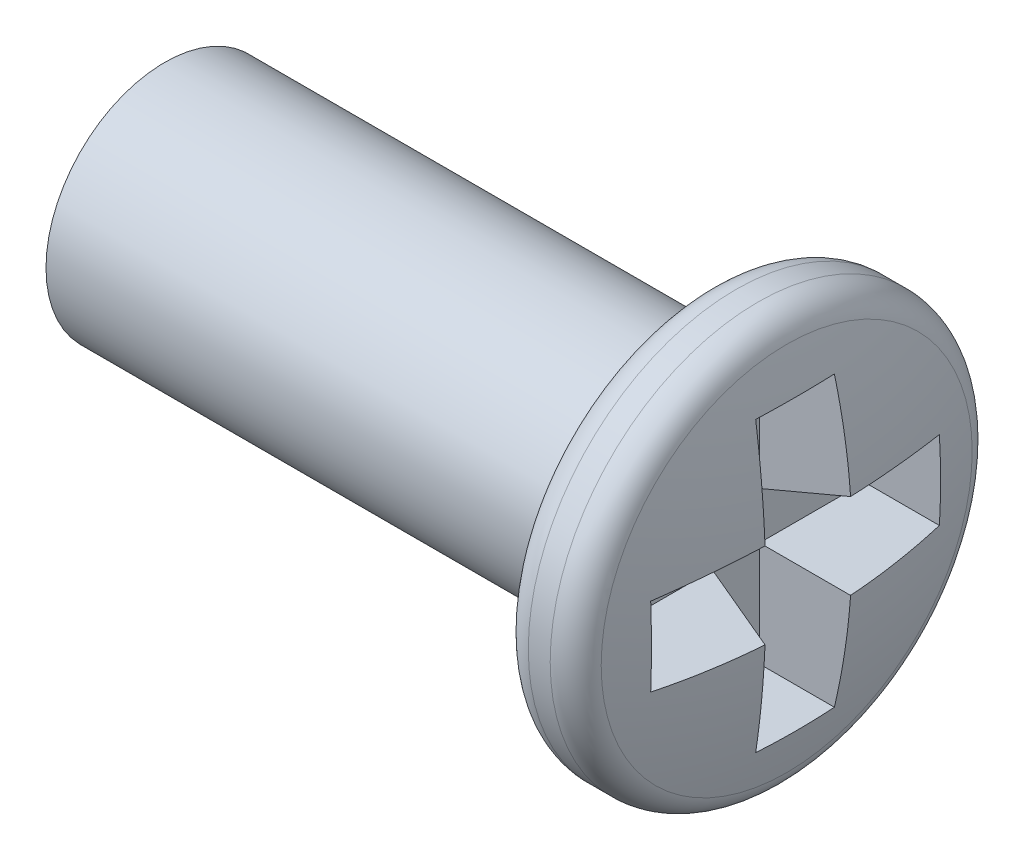
ISO-10303-21;
HEADER;
FILE_DESCRIPTION(('STEP AP214'),'2;1');
FILE_NAME('part.step','',(''),(''),'','','');
FILE_SCHEMA(('AUTOMOTIVE_DESIGN { 1 0 10303 214 1 1 1 1 }'));
ENDSEC;
DATA;
#1=APPLICATION_CONTEXT('core data for automotive mechanical design processes');
#2=APPLICATION_PROTOCOL_DEFINITION('international standard','automotive_design',2000,#1);
#3=PRODUCT_CONTEXT('',#1,'mechanical');
#4=PRODUCT('Part','Part','',(#3));
#5=PRODUCT_RELATED_PRODUCT_CATEGORY('part','',(#4));
#6=PRODUCT_DEFINITION_FORMATION('','',#4);
#7=PRODUCT_DEFINITION_CONTEXT('part definition',#1,'design');
#8=PRODUCT_DEFINITION('design','',#6,#7);
#9=PRODUCT_DEFINITION_SHAPE('','',#8);
#10=(LENGTH_UNIT() NAMED_UNIT(*) SI_UNIT(.MILLI.,.METRE.));
#11=(NAMED_UNIT(*) PLANE_ANGLE_UNIT() SI_UNIT($,.RADIAN.));
#12=(NAMED_UNIT(*) SI_UNIT($,.STERADIAN.) SOLID_ANGLE_UNIT());
#13=UNCERTAINTY_MEASURE_WITH_UNIT(LENGTH_MEASURE(1.E-05),#10,'distance_accuracy_value','');
#14=(GEOMETRIC_REPRESENTATION_CONTEXT(3) GLOBAL_UNCERTAINTY_ASSIGNED_CONTEXT((#13)) GLOBAL_UNIT_ASSIGNED_CONTEXT((#10,
#11,#12)) REPRESENTATION_CONTEXT('',''));
#15=CARTESIAN_POINT('',(0.,0.,0.));
#16=DIRECTION('',(0.,0.,1.));
#17=DIRECTION('',(1.,0.,0.));
#18=AXIS2_PLACEMENT_3D('',#15,#16,#17);
#19=CARTESIAN_POINT('',(0.,0.8,0.));
#20=DIRECTION('',(1.,0.,0.));
#21=DIRECTION('',(0.,0.,-1.));
#22=AXIS2_PLACEMENT_3D('',#19,#20,#21);
#23=PLANE('',#22);
#24=CARTESIAN_POINT('',(0.,0.,0.));
#25=DIRECTION('',(-1.,0.,0.));
#26=DIRECTION('',(0.,0.,1.));
#27=AXIS2_PLACEMENT_3D('',#24,#25,#26);
#28=CIRCLE('',#27,0.8);
#29=CARTESIAN_POINT('',(0.,0.,0.8));
#30=VERTEX_POINT('',#29);
#31=EDGE_CURVE('E158',#30,#30,#28,.T.);
#32=ORIENTED_EDGE('',*,*,#31,.T.);
#33=EDGE_LOOP('',(#32));
#34=FACE_BOUND('',#33,.T.);
#35=ADVANCED_FACE('F41',(#34),#23,.F.);
#36=CARTESIAN_POINT('',(-0.649999999999987,0.,0.));
#37=DIRECTION('',(-1.,0.,0.));
#38=DIRECTION('',(0.,1.,0.));
#39=AXIS2_PLACEMENT_3D('',#36,#37,#38);
#40=SPHERICAL_SURFACE('',#39,4.99999999999999);
#41=CARTESIAN_POINT('',(-0.388246241920137,0.,-0.976878324226091));
#42=DIRECTION('',(-0.258819045102521,0.,0.965925826289068));
#43=DIRECTION('',(0.965925826289068,0.,0.258819045102521));
#44=AXIS2_PLACEMENT_3D('',#41,#42,#43);
#45=CIRCLE('',#44,4.89665127508465);
#46=CARTESIAN_POINT('',(4.33335234348308,0.288270203716636,0.288270203716636));
#47=VERTEX_POINT('',#46);
#48=CARTESIAN_POINT('',(4.24733772425329,0.972491726120527,0.265222655956741));
#49=VERTEX_POINT('',#48);
#50=EDGE_CURVE('E240',#47,#49,#45,.T.);
#51=ORIENTED_EDGE('',*,*,#50,.T.);
#52=CARTESIAN_POINT('',(-0.565063509461084,-0.31698729810778,0.));
#53=DIRECTION('',(-0.258819045102521,0.965925826289068,0.));
#54=DIRECTION('',(-0.965925826289068,-0.258819045102521,0.));
#55=AXIS2_PLACEMENT_3D('',#52,#53,#54);
#56=CIRCLE('',#55,4.98921886124603);
#57=CARTESIAN_POINT('',(4.24733772425329,0.972491726120527,-0.265222655956741));
#58=VERTEX_POINT('',#57);
#59=EDGE_CURVE('E11',#49,#58,#56,.T.);
#60=ORIENTED_EDGE('',*,*,#59,.T.);
#61=CARTESIAN_POINT('',(-0.388246241920137,0.,0.976878324226092));
#62=DIRECTION('',(-0.258819045102521,0.,-0.965925826289068));
#63=DIRECTION('',(-0.965925826289068,0.,0.258819045102521));
#64=AXIS2_PLACEMENT_3D('',#61,#62,#63);
#65=CIRCLE('',#64,4.89665127508465);
#66=CARTESIAN_POINT('',(4.33335234348308,0.288270203716636,-0.288270203716636));
#67=VERTEX_POINT('',#66);
#68=EDGE_CURVE('E50',#58,#67,#65,.T.);
#69=ORIENTED_EDGE('',*,*,#68,.T.);
#70=CARTESIAN_POINT('',(-0.388246241920137,-0.976878324226091,0.));
#71=DIRECTION('',(-0.258819045102521,0.965925826289068,0.));
#72=DIRECTION('',(-0.965925826289068,-0.258819045102521,0.));
#73=AXIS2_PLACEMENT_3D('',#70,#71,#72);
#74=CIRCLE('',#73,4.89665127508465);
#75=CARTESIAN_POINT('',(4.24733772425329,0.265222655956742,-0.972491726120527));
#76=VERTEX_POINT('',#75);
#77=EDGE_CURVE('E276',#67,#76,#74,.T.);
#78=ORIENTED_EDGE('',*,*,#77,.T.);
#79=CARTESIAN_POINT('',(-0.565063509461084,0.,0.31698729810778));
#80=DIRECTION('',(-0.258819045102521,0.,-0.965925826289068));
#81=DIRECTION('',(-0.965925826289068,0.,0.258819045102521));
#82=AXIS2_PLACEMENT_3D('',#79,#80,#81);
#83=CIRCLE('',#82,4.98921886124603);
#84=CARTESIAN_POINT('',(4.24733772425329,-0.265222655956742,-0.972491726120527));
#85=VERTEX_POINT('',#84);
#86=EDGE_CURVE('E272',#76,#85,#83,.T.);
#87=ORIENTED_EDGE('',*,*,#86,.T.);
#88=CARTESIAN_POINT('',(-0.388246241920137,0.976878324226091,0.));
#89=DIRECTION('',(-0.258819045102521,-0.965925826289068,0.));
#90=DIRECTION('',(0.965925826289068,-0.258819045102521,0.));
#91=AXIS2_PLACEMENT_3D('',#88,#89,#90);
#92=CIRCLE('',#91,4.89665127508465);
#93=CARTESIAN_POINT('',(4.33335234348308,-0.288270203716636,-0.288270203716636));
#94=VERTEX_POINT('',#93);
#95=EDGE_CURVE('E268',#85,#94,#92,.T.);
#96=ORIENTED_EDGE('',*,*,#95,.T.);
#97=CARTESIAN_POINT('',(-0.388246241920137,0.,0.976878324226091));
#98=DIRECTION('',(-0.258819045102521,0.,-0.965925826289068));
#99=DIRECTION('',(-0.965925826289068,0.,0.258819045102521));
#100=AXIS2_PLACEMENT_3D('',#97,#98,#99);
#101=CIRCLE('',#100,4.89665127508465);
#102=CARTESIAN_POINT('',(4.24733772425329,-0.972491726120527,-0.265222655956742));
#103=VERTEX_POINT('',#102);
#104=EDGE_CURVE('E264',#94,#103,#101,.T.);
#105=ORIENTED_EDGE('',*,*,#104,.T.);
#106=CARTESIAN_POINT('',(-0.565063509461084,0.31698729810778,0.));
#107=DIRECTION('',(-0.258819045102521,-0.965925826289068,0.));
#108=DIRECTION('',(0.965925826289068,-0.258819045102521,0.));
#109=AXIS2_PLACEMENT_3D('',#106,#107,#108);
#110=CIRCLE('',#109,4.98921886124603);
#111=CARTESIAN_POINT('',(4.24733772425329,-0.972491726120527,0.265222655956742));
#112=VERTEX_POINT('',#111);
#113=EDGE_CURVE('E260',#103,#112,#110,.T.);
#114=ORIENTED_EDGE('',*,*,#113,.T.);
#115=CARTESIAN_POINT('',(-0.388246241920137,0.,-0.976878324226091));
#116=DIRECTION('',(-0.258819045102521,0.,0.965925826289068));
#117=DIRECTION('',(0.965925826289068,0.,0.258819045102521));
#118=AXIS2_PLACEMENT_3D('',#115,#116,#117);
#119=CIRCLE('',#118,4.89665127508465);
#120=CARTESIAN_POINT('',(4.33335234348308,-0.288270203716636,0.288270203716636));
#121=VERTEX_POINT('',#120);
#122=EDGE_CURVE('E256',#112,#121,#119,.T.);
#123=ORIENTED_EDGE('',*,*,#122,.T.);
#124=CARTESIAN_POINT('',(-0.388246241920137,0.976878324226091,0.));
#125=DIRECTION('',(-0.258819045102521,-0.965925826289068,0.));
#126=DIRECTION('',(0.965925826289068,-0.258819045102521,0.));
#127=AXIS2_PLACEMENT_3D('',#124,#125,#126);
#128=CIRCLE('',#127,4.89665127508465);
#129=CARTESIAN_POINT('',(4.24733772425329,-0.265222655956742,0.972491726120527));
#130=VERTEX_POINT('',#129);
#131=EDGE_CURVE('E252',#121,#130,#128,.T.);
#132=ORIENTED_EDGE('',*,*,#131,.T.);
#133=CARTESIAN_POINT('',(-0.565063509461084,0.,-0.31698729810778));
#134=DIRECTION('',(-0.258819045102521,0.,0.965925826289068));
#135=DIRECTION('',(0.965925826289068,0.,0.258819045102521));
#136=AXIS2_PLACEMENT_3D('',#133,#134,#135);
#137=CIRCLE('',#136,4.98921886124603);
#138=CARTESIAN_POINT('',(4.24733772425329,0.265222655956742,0.972491726120527));
#139=VERTEX_POINT('',#138);
#140=EDGE_CURVE('E248',#130,#139,#137,.T.);
#141=ORIENTED_EDGE('',*,*,#140,.T.);
#142=CARTESIAN_POINT('',(-0.388246241920137,-0.976878324226091,0.));
#143=DIRECTION('',(-0.258819045102521,0.965925826289068,0.));
#144=DIRECTION('',(-0.965925826289068,-0.258819045102521,0.));
#145=AXIS2_PLACEMENT_3D('',#142,#143,#144);
#146=CIRCLE('',#145,4.89665127508465);
#147=EDGE_CURVE('E244',#139,#47,#146,.T.);
#148=ORIENTED_EDGE('',*,*,#147,.T.);
#149=EDGE_LOOP('',(#51,#60,#69,#78,#87,#96,#105,#114,#123,#132,#141,#148));
#150=FACE_BOUND('',#149,.T.);
#151=CARTESIAN_POINT('',(4.19122918275927,0.,0.));
#152=DIRECTION('',(-1.,0.,0.));
#153=DIRECTION('',(0.,0.,1.));
#154=AXIS2_PLACEMENT_3D('',#151,#152,#153);
#155=CIRCLE('',#154,1.25);
#156=CARTESIAN_POINT('',(4.19122918275927,0.,1.25));
#157=VERTEX_POINT('',#156);
#158=EDGE_CURVE('E236',#157,#157,#155,.F.);
#159=ORIENTED_EDGE('',*,*,#158,.T.);
#160=EDGE_LOOP('',(#159));
#161=FACE_BOUND('',#160,.T.);
#162=ADVANCED_FACE('F281',(#150,#161),#40,.T.);
#163=CARTESIAN_POINT('',(-102.038169229657,0.,0.));
#164=DIRECTION('',(-1.,0.,0.));
#165=DIRECTION('',(0.,0.,1.));
#166=AXIS2_PLACEMENT_3D('',#163,#164,#165);
#167=CYLINDRICAL_SURFACE('',#166,1.4);
#168=CARTESIAN_POINT('',(3.85000000000001,0.,0.));
#169=DIRECTION('',(1.,0.,0.));
#170=DIRECTION('',(0.,0.,-1.));
#171=AXIS2_PLACEMENT_3D('',#168,#169,#170);
#172=CIRCLE('',#171,1.4);
#173=CARTESIAN_POINT('',(3.85000000000001,0.,-1.4));
#174=VERTEX_POINT('',#173);
#175=EDGE_CURVE('E232',#174,#174,#172,.T.);
#176=ORIENTED_EDGE('',*,*,#175,.T.);
#177=EDGE_LOOP('',(#176));
#178=FACE_BOUND('',#177,.T.);
#179=CARTESIAN_POINT('',(3.99758001544891,0.,0.));
#180=DIRECTION('',(-1.,0.,0.));
#181=DIRECTION('',(0.,0.,1.));
#182=AXIS2_PLACEMENT_3D('',#179,#180,#181);
#183=CIRCLE('',#182,1.4);
#184=CARTESIAN_POINT('',(3.99758001544891,0.,1.4));
#185=VERTEX_POINT('',#184);
#186=EDGE_CURVE('E228',#185,#185,#183,.T.);
#187=ORIENTED_EDGE('',*,*,#186,.T.);
#188=EDGE_LOOP('',(#187));
#189=FACE_BOUND('',#188,.T.);
#190=ADVANCED_FACE('F359',(#178,#189),#167,.T.);
#191=CARTESIAN_POINT('',(3.65,1.4,0.));
#192=DIRECTION('',(1.,0.,0.));
#193=DIRECTION('',(0.,0.,-1.));
#194=AXIS2_PLACEMENT_3D('',#191,#192,#193);
#195=PLANE('',#194);
#196=CARTESIAN_POINT('',(3.65,0.,0.));
#197=DIRECTION('',(1.,0.,0.));
#198=DIRECTION('',(0.,0.,-1.));
#199=AXIS2_PLACEMENT_3D('',#196,#197,#198);
#200=CIRCLE('',#199,1.2);
#201=CARTESIAN_POINT('',(3.65,0.,-1.2));
#202=VERTEX_POINT('',#201);
#203=EDGE_CURVE('E224',#202,#202,#200,.F.);
#204=ORIENTED_EDGE('',*,*,#203,.T.);
#205=EDGE_LOOP('',(#204));
#206=FACE_BOUND('',#205,.T.);
#207=CARTESIAN_POINT('',(3.65,0.,0.));
#208=DIRECTION('',(-1.,0.,0.));
#209=DIRECTION('',(0.,0.,1.));
#210=AXIS2_PLACEMENT_3D('',#207,#208,#209);
#211=CIRCLE('',#210,0.8);
#212=CARTESIAN_POINT('',(3.65,0.,0.8));
#213=VERTEX_POINT('',#212);
#214=EDGE_CURVE('E220',#213,#213,#211,.T.);
#215=ORIENTED_EDGE('',*,*,#214,.F.);
#216=EDGE_LOOP('',(#215));
#217=FACE_BOUND('',#216,.T.);
#218=ADVANCED_FACE('F371',(#206,#217),#195,.F.);
#219=CARTESIAN_POINT('',(-102.038169229657,0.,0.));
#220=DIRECTION('',(-1.,0.,0.));
#221=DIRECTION('',(0.,0.,1.));
#222=AXIS2_PLACEMENT_3D('',#219,#220,#221);
#223=CYLINDRICAL_SURFACE('',#222,0.8);
#224=ORIENTED_EDGE('',*,*,#31,.F.);
#225=EDGE_LOOP('',(#224));
#226=FACE_BOUND('',#225,.T.);
#227=ORIENTED_EDGE('',*,*,#214,.T.);
#228=EDGE_LOOP('',(#227));
#229=FACE_BOUND('',#228,.T.);
#230=ADVANCED_FACE('F364',(#226,#229),#223,.T.);
#231=CARTESIAN_POINT('',(3.85000000000001,0.,0.));
#232=DIRECTION('',(1.,0.,0.));
#233=DIRECTION('',(0.,0.,-1.));
#234=AXIS2_PLACEMENT_3D('',#231,#232,#233);
#235=TOROIDAL_SURFACE('',#234,1.2,0.2);
#236=ORIENTED_EDGE('',*,*,#175,.F.);
#237=EDGE_LOOP('',(#236));
#238=FACE_BOUND('',#237,.T.);
#239=ORIENTED_EDGE('',*,*,#203,.F.);
#240=EDGE_LOOP('',(#239));
#241=FACE_BOUND('',#240,.T.);
#242=ADVANCED_FACE('F362',(#238,#241),#235,.T.);
#243=CARTESIAN_POINT('',(3.9975800154489,0.,0.));
#244=DIRECTION('',(-1.,0.,0.));
#245=DIRECTION('',(0.,0.,1.));
#246=AXIS2_PLACEMENT_3D('',#243,#244,#245);
#247=TOROIDAL_SURFACE('',#246,1.2,0.2);
#248=ORIENTED_EDGE('',*,*,#158,.F.);
#249=EDGE_LOOP('',(#248));
#250=FACE_BOUND('',#249,.T.);
#251=ORIENTED_EDGE('',*,*,#186,.F.);
#252=EDGE_LOOP('',(#251));
#253=FACE_BOUND('',#252,.T.);
#254=ADVANCED_FACE('F43',(#250,#253),#247,.T.);
#255=CARTESIAN_POINT('',(4.35,1.,0.292730929836214));
#256=DIRECTION('',(-0.258819045102521,0.965925826289068,0.));
#257=DIRECTION('',(-0.965925826289068,-0.258819045102521,0.));
#258=AXIS2_PLACEMENT_3D('',#255,#256,#257);
#259=PLANE('',#258);
#260=DIRECTION('',(0.935113126531029,0.250562807085732,0.250562807085732));
#261=VECTOR('',#260,1.);
#262=CARTESIAN_POINT('',(4.35,1.,0.292730929836214));
#263=LINE('',#262,#261);
#264=CARTESIAN_POINT('',(3.85,0.866025403784438,0.158756333620653));
#265=VERTEX_POINT('',#264);
#266=EDGE_CURVE('E60',#265,#49,#263,.T.);
#267=ORIENTED_EDGE('',*,*,#266,.F.);
#268=DIRECTION('',(0.,0.,1.));
#269=VECTOR('',#268,1.);
#270=CARTESIAN_POINT('',(3.85,0.866025403784438,0.292730929836214));
#271=LINE('',#270,#269);
#272=CARTESIAN_POINT('',(3.85,0.866025403784438,-0.158756333620653));
#273=VERTEX_POINT('',#272);
#274=EDGE_CURVE('E162',#273,#265,#271,.T.);
#275=ORIENTED_EDGE('',*,*,#274,.F.);
#276=DIRECTION('',(0.935113126531029,0.250562807085732,-0.250562807085732));
#277=VECTOR('',#276,1.);
#278=CARTESIAN_POINT('',(4.35,1.,-0.292730929836215));
#279=LINE('',#278,#277);
#280=EDGE_CURVE('E151',#273,#58,#279,.T.);
#281=ORIENTED_EDGE('',*,*,#280,.T.);
#282=ORIENTED_EDGE('',*,*,#59,.F.);
#283=EDGE_LOOP('',(#267,#275,#281,#282));
#284=FACE_BOUND('',#283,.T.);
#285=ADVANCED_FACE('F163',(#284),#259,.F.);
#286=CARTESIAN_POINT('',(4.35,1.,-0.292730929836215));
#287=DIRECTION('',(-0.258819045102521,0.,-0.965925826289068));
#288=DIRECTION('',(-0.965925826289068,0.,0.258819045102521));
#289=AXIS2_PLACEMENT_3D('',#286,#287,#288);
#290=PLANE('',#289);
#291=ORIENTED_EDGE('',*,*,#280,.F.);
#292=DIRECTION('',(0.,1.,0.));
#293=VECTOR('',#292,1.);
#294=CARTESIAN_POINT('',(3.85,1.,-0.158756333620653));
#295=LINE('',#294,#293);
#296=CARTESIAN_POINT('',(3.85,0.158756333620653,-0.158756333620653));
#297=VERTEX_POINT('',#296);
#298=EDGE_CURVE('E155',#297,#273,#295,.T.);
#299=ORIENTED_EDGE('',*,*,#298,.F.);
#300=DIRECTION('',(0.935113126531029,0.250562807085732,-0.250562807085732));
#301=VECTOR('',#300,1.);
#302=CARTESIAN_POINT('',(4.51571637530692,0.337134498772317,-0.337134498772317));
#303=LINE('',#302,#301);
#304=EDGE_CURVE('E159',#297,#67,#303,.T.);
#305=ORIENTED_EDGE('',*,*,#304,.T.);
#306=ORIENTED_EDGE('',*,*,#68,.F.);
#307=EDGE_LOOP('',(#291,#299,#305,#306));
#308=FACE_BOUND('',#307,.T.);
#309=ADVANCED_FACE('F153',(#308),#290,.F.);
#310=CARTESIAN_POINT('',(4.35,0.292730929836215,-0.292730929836214));
#311=DIRECTION('',(-0.258819045102521,0.965925826289068,0.));
#312=DIRECTION('',(-0.965925826289068,-0.258819045102521,0.));
#313=AXIS2_PLACEMENT_3D('',#310,#311,#312);
#314=PLANE('',#313);
#315=ORIENTED_EDGE('',*,*,#304,.F.);
#316=DIRECTION('',(0.,0.,1.));
#317=VECTOR('',#316,1.);
#318=CARTESIAN_POINT('',(3.85,0.158756333620653,-0.292730929836214));
#319=LINE('',#318,#317);
#320=CARTESIAN_POINT('',(3.85,0.158756333620653,-0.866025403784438));
#321=VERTEX_POINT('',#320);
#322=EDGE_CURVE('E173',#321,#297,#319,.T.);
#323=ORIENTED_EDGE('',*,*,#322,.F.);
#324=DIRECTION('',(0.935113126531029,0.250562807085732,-0.250562807085732));
#325=VECTOR('',#324,1.);
#326=CARTESIAN_POINT('',(4.35,0.292730929836215,-1.));
#327=LINE('',#326,#325);
#328=EDGE_CURVE('E319',#321,#76,#327,.T.);
#329=ORIENTED_EDGE('',*,*,#328,.T.);
#330=ORIENTED_EDGE('',*,*,#77,.F.);
#331=EDGE_LOOP('',(#315,#323,#329,#330));
#332=FACE_BOUND('',#331,.T.);
#333=ADVANCED_FACE('F323',(#332),#314,.F.);
#334=CARTESIAN_POINT('',(4.35,0.292730929836215,-1.));
#335=DIRECTION('',(-0.258819045102521,0.,-0.965925826289068));
#336=DIRECTION('',(-0.965925826289068,0.,0.258819045102521));
#337=AXIS2_PLACEMENT_3D('',#334,#335,#336);
#338=PLANE('',#337);
#339=ORIENTED_EDGE('',*,*,#328,.F.);
#340=DIRECTION('',(0.,1.,0.));
#341=VECTOR('',#340,1.);
#342=CARTESIAN_POINT('',(3.85,0.292730929836215,-0.866025403784438));
#343=LINE('',#342,#341);
#344=CARTESIAN_POINT('',(3.85,-0.158756333620653,-0.866025403784438));
#345=VERTEX_POINT('',#344);
#346=EDGE_CURVE('E181',#345,#321,#343,.T.);
#347=ORIENTED_EDGE('',*,*,#346,.F.);
#348=DIRECTION('',(0.935113126531029,-0.250562807085732,-0.250562807085732));
#349=VECTOR('',#348,1.);
#350=CARTESIAN_POINT('',(4.35,-0.292730929836214,-1.));
#351=LINE('',#350,#349);
#352=EDGE_CURVE('E315',#345,#85,#351,.T.);
#353=ORIENTED_EDGE('',*,*,#352,.T.);
#354=ORIENTED_EDGE('',*,*,#86,.F.);
#355=EDGE_LOOP('',(#339,#347,#353,#354));
#356=FACE_BOUND('',#355,.T.);
#357=ADVANCED_FACE('F326',(#356),#338,.F.);
#358=CARTESIAN_POINT('',(4.35,-0.292730929836214,-1.));
#359=DIRECTION('',(-0.258819045102521,-0.965925826289068,0.));
#360=DIRECTION('',(0.965925826289068,-0.258819045102521,0.));
#361=AXIS2_PLACEMENT_3D('',#358,#359,#360);
#362=PLANE('',#361);
#363=ORIENTED_EDGE('',*,*,#352,.F.);
#364=DIRECTION('',(0.,0.,-1.));
#365=VECTOR('',#364,1.);
#366=CARTESIAN_POINT('',(3.85,-0.158756333620653,-1.));
#367=LINE('',#366,#365);
#368=CARTESIAN_POINT('',(3.85,-0.158756333620653,-0.158756333620653));
#369=VERTEX_POINT('',#368);
#370=EDGE_CURVE('E187',#369,#345,#367,.T.);
#371=ORIENTED_EDGE('',*,*,#370,.F.);
#372=DIRECTION('',(0.935113126531029,-0.250562807085732,-0.250562807085732));
#373=VECTOR('',#372,1.);
#374=CARTESIAN_POINT('',(4.51571637530692,-0.337134498772317,-0.337134498772317));
#375=LINE('',#374,#373);
#376=EDGE_CURVE('E311',#369,#94,#375,.T.);
#377=ORIENTED_EDGE('',*,*,#376,.T.);
#378=ORIENTED_EDGE('',*,*,#95,.F.);
#379=EDGE_LOOP('',(#363,#371,#377,#378));
#380=FACE_BOUND('',#379,.T.);
#381=ADVANCED_FACE('F328',(#380),#362,.F.);
#382=CARTESIAN_POINT('',(4.35,-0.292730929836215,-0.292730929836214));
#383=DIRECTION('',(-0.258819045102521,0.,-0.965925826289068));
#384=DIRECTION('',(-0.965925826289068,0.,0.258819045102521));
#385=AXIS2_PLACEMENT_3D('',#382,#383,#384);
#386=PLANE('',#385);
#387=ORIENTED_EDGE('',*,*,#376,.F.);
#388=DIRECTION('',(0.,1.,0.));
#389=VECTOR('',#388,1.);
#390=CARTESIAN_POINT('',(3.85,-0.292730929836215,-0.158756333620653));
#391=LINE('',#390,#389);
#392=CARTESIAN_POINT('',(3.85,-0.866025403784438,-0.158756333620653));
#393=VERTEX_POINT('',#392);
#394=EDGE_CURVE('E191',#393,#369,#391,.T.);
#395=ORIENTED_EDGE('',*,*,#394,.F.);
#396=DIRECTION('',(0.935113126531029,-0.250562807085732,-0.250562807085732));
#397=VECTOR('',#396,1.);
#398=CARTESIAN_POINT('',(4.35,-1.,-0.292730929836215));
#399=LINE('',#398,#397);
#400=EDGE_CURVE('E307',#393,#103,#399,.T.);
#401=ORIENTED_EDGE('',*,*,#400,.T.);
#402=ORIENTED_EDGE('',*,*,#104,.F.);
#403=EDGE_LOOP('',(#387,#395,#401,#402));
#404=FACE_BOUND('',#403,.T.);
#405=ADVANCED_FACE('F332',(#404),#386,.F.);
#406=CARTESIAN_POINT('',(4.35,-1.,-0.292730929836215));
#407=DIRECTION('',(-0.258819045102521,-0.965925826289068,0.));
#408=DIRECTION('',(0.965925826289068,-0.258819045102521,0.));
#409=AXIS2_PLACEMENT_3D('',#406,#407,#408);
#410=PLANE('',#409);
#411=ORIENTED_EDGE('',*,*,#400,.F.);
#412=DIRECTION('',(0.,0.,-1.));
#413=VECTOR('',#412,1.);
#414=CARTESIAN_POINT('',(3.85,-0.866025403784438,-0.292730929836215));
#415=LINE('',#414,#413);
#416=CARTESIAN_POINT('',(3.85,-0.866025403784438,0.158756333620653));
#417=VERTEX_POINT('',#416);
#418=EDGE_CURVE('E195',#417,#393,#415,.T.);
#419=ORIENTED_EDGE('',*,*,#418,.F.);
#420=DIRECTION('',(0.935113126531029,-0.250562807085732,0.250562807085732));
#421=VECTOR('',#420,1.);
#422=CARTESIAN_POINT('',(4.35,-1.,0.292730929836214));
#423=LINE('',#422,#421);
#424=EDGE_CURVE('E303',#417,#112,#423,.T.);
#425=ORIENTED_EDGE('',*,*,#424,.T.);
#426=ORIENTED_EDGE('',*,*,#113,.F.);
#427=EDGE_LOOP('',(#411,#419,#425,#426));
#428=FACE_BOUND('',#427,.T.);
#429=ADVANCED_FACE('F335',(#428),#410,.F.);
#430=CARTESIAN_POINT('',(4.35,-1.,0.292730929836214));
#431=DIRECTION('',(-0.258819045102521,0.,0.965925826289068));
#432=DIRECTION('',(0.965925826289068,0.,0.258819045102521));
#433=AXIS2_PLACEMENT_3D('',#430,#431,#432);
#434=PLANE('',#433);
#435=ORIENTED_EDGE('',*,*,#424,.F.);
#436=DIRECTION('',(0.,-1.,0.));
#437=VECTOR('',#436,1.);
#438=CARTESIAN_POINT('',(3.85,-1.,0.158756333620653));
#439=LINE('',#438,#437);
#440=CARTESIAN_POINT('',(3.85,-0.158756333620653,0.158756333620653));
#441=VERTEX_POINT('',#440);
#442=EDGE_CURVE('E199',#441,#417,#439,.T.);
#443=ORIENTED_EDGE('',*,*,#442,.F.);
#444=DIRECTION('',(0.935113126531029,-0.250562807085732,0.250562807085732));
#445=VECTOR('',#444,1.);
#446=CARTESIAN_POINT('',(4.51571637530692,-0.337134498772317,0.337134498772317));
#447=LINE('',#446,#445);
#448=EDGE_CURVE('E299',#441,#121,#447,.T.);
#449=ORIENTED_EDGE('',*,*,#448,.T.);
#450=ORIENTED_EDGE('',*,*,#122,.F.);
#451=EDGE_LOOP('',(#435,#443,#449,#450));
#452=FACE_BOUND('',#451,.T.);
#453=ADVANCED_FACE('F337',(#452),#434,.F.);
#454=CARTESIAN_POINT('',(4.35,-0.292730929836214,0.292730929836214));
#455=DIRECTION('',(-0.258819045102521,-0.965925826289068,0.));
#456=DIRECTION('',(0.965925826289068,-0.258819045102521,0.));
#457=AXIS2_PLACEMENT_3D('',#454,#455,#456);
#458=PLANE('',#457);
#459=ORIENTED_EDGE('',*,*,#448,.F.);
#460=DIRECTION('',(0.,0.,-1.));
#461=VECTOR('',#460,1.);
#462=CARTESIAN_POINT('',(3.85,-0.158756333620653,0.292730929836214));
#463=LINE('',#462,#461);
#464=CARTESIAN_POINT('',(3.85,-0.158756333620653,0.866025403784438));
#465=VERTEX_POINT('',#464);
#466=EDGE_CURVE('E203',#465,#441,#463,.T.);
#467=ORIENTED_EDGE('',*,*,#466,.F.);
#468=DIRECTION('',(0.935113126531029,-0.250562807085732,0.250562807085732));
#469=VECTOR('',#468,1.);
#470=CARTESIAN_POINT('',(4.35,-0.292730929836214,1.));
#471=LINE('',#470,#469);
#472=EDGE_CURVE('E293',#465,#130,#471,.T.);
#473=ORIENTED_EDGE('',*,*,#472,.T.);
#474=ORIENTED_EDGE('',*,*,#131,.F.);
#475=EDGE_LOOP('',(#459,#467,#473,#474));
#476=FACE_BOUND('',#475,.T.);
#477=ADVANCED_FACE('F341',(#476),#458,.F.);
#478=CARTESIAN_POINT('',(4.35,-0.292730929836214,1.));
#479=DIRECTION('',(-0.258819045102521,0.,0.965925826289068));
#480=DIRECTION('',(0.965925826289068,0.,0.258819045102521));
#481=AXIS2_PLACEMENT_3D('',#478,#479,#480);
#482=PLANE('',#481);
#483=ORIENTED_EDGE('',*,*,#472,.F.);
#484=DIRECTION('',(0.,-1.,0.));
#485=VECTOR('',#484,1.);
#486=CARTESIAN_POINT('',(3.85,-0.292730929836214,0.866025403784438));
#487=LINE('',#486,#485);
#488=CARTESIAN_POINT('',(3.85,0.158756333620653,0.866025403784438));
#489=VERTEX_POINT('',#488);
#490=EDGE_CURVE('E207',#489,#465,#487,.T.);
#491=ORIENTED_EDGE('',*,*,#490,.F.);
#492=DIRECTION('',(0.935113126531029,0.250562807085732,0.250562807085732));
#493=VECTOR('',#492,1.);
#494=CARTESIAN_POINT('',(4.35,0.292730929836215,1.));
#495=LINE('',#494,#493);
#496=EDGE_CURVE('E290',#489,#139,#495,.T.);
#497=ORIENTED_EDGE('',*,*,#496,.T.);
#498=ORIENTED_EDGE('',*,*,#140,.F.);
#499=EDGE_LOOP('',(#483,#491,#497,#498));
#500=FACE_BOUND('',#499,.T.);
#501=ADVANCED_FACE('F344',(#500),#482,.F.);
#502=CARTESIAN_POINT('',(4.35,0.292730929836215,1.));
#503=DIRECTION('',(-0.258819045102521,0.965925826289068,0.));
#504=DIRECTION('',(-0.965925826289068,-0.258819045102521,0.));
#505=AXIS2_PLACEMENT_3D('',#502,#503,#504);
#506=PLANE('',#505);
#507=ORIENTED_EDGE('',*,*,#496,.F.);
#508=DIRECTION('',(0.,0.,1.));
#509=VECTOR('',#508,1.);
#510=CARTESIAN_POINT('',(3.85,0.158756333620653,1.));
#511=LINE('',#510,#509);
#512=CARTESIAN_POINT('',(3.85,0.158756333620653,0.158756333620653));
#513=VERTEX_POINT('',#512);
#514=EDGE_CURVE('E211',#513,#489,#511,.T.);
#515=ORIENTED_EDGE('',*,*,#514,.F.);
#516=DIRECTION('',(0.935113126531029,0.250562807085732,0.250562807085732));
#517=VECTOR('',#516,1.);
#518=CARTESIAN_POINT('',(4.51571637530692,0.337134498772317,0.337134498772317));
#519=LINE('',#518,#517);
#520=EDGE_CURVE('E179',#513,#47,#519,.T.);
#521=ORIENTED_EDGE('',*,*,#520,.T.);
#522=ORIENTED_EDGE('',*,*,#147,.F.);
#523=EDGE_LOOP('',(#507,#515,#521,#522));
#524=FACE_BOUND('',#523,.T.);
#525=ADVANCED_FACE('F287',(#524),#506,.F.);
#526=CARTESIAN_POINT('',(4.35,0.292730929836215,0.292730929836214));
#527=DIRECTION('',(-0.258819045102521,0.,0.965925826289068));
#528=DIRECTION('',(0.965925826289068,0.,0.258819045102521));
#529=AXIS2_PLACEMENT_3D('',#526,#527,#528);
#530=PLANE('',#529);
#531=ORIENTED_EDGE('',*,*,#520,.F.);
#532=DIRECTION('',(0.,-1.,0.));
#533=VECTOR('',#532,1.);
#534=CARTESIAN_POINT('',(3.85,0.292730929836215,0.158756333620653));
#535=LINE('',#534,#533);
#536=EDGE_CURVE('E167',#265,#513,#535,.T.);
#537=ORIENTED_EDGE('',*,*,#536,.F.);
#538=ORIENTED_EDGE('',*,*,#266,.T.);
#539=ORIENTED_EDGE('',*,*,#50,.F.);
#540=EDGE_LOOP('',(#531,#537,#538,#539));
#541=FACE_BOUND('',#540,.T.);
#542=ADVANCED_FACE('F284',(#541),#530,.F.);
#543=CARTESIAN_POINT('',(3.85,0.,0.));
#544=DIRECTION('',(-1.,0.,0.));
#545=DIRECTION('',(0.,0.,1.));
#546=AXIS2_PLACEMENT_3D('',#543,#544,#545);
#547=PLANE('',#546);
#548=ORIENTED_EDGE('',*,*,#274,.T.);
#549=ORIENTED_EDGE('',*,*,#536,.T.);
#550=ORIENTED_EDGE('',*,*,#514,.T.);
#551=ORIENTED_EDGE('',*,*,#490,.T.);
#552=ORIENTED_EDGE('',*,*,#466,.T.);
#553=ORIENTED_EDGE('',*,*,#442,.T.);
#554=ORIENTED_EDGE('',*,*,#418,.T.);
#555=ORIENTED_EDGE('',*,*,#394,.T.);
#556=ORIENTED_EDGE('',*,*,#370,.T.);
#557=ORIENTED_EDGE('',*,*,#346,.T.);
#558=ORIENTED_EDGE('',*,*,#322,.T.);
#559=ORIENTED_EDGE('',*,*,#298,.T.);
#560=EDGE_LOOP('',(#548,#549,#550,#551,#552,#553,#554,#555,#556,#557,#558,#559));
#561=FACE_BOUND('',#560,.T.);
#562=ADVANCED_FACE('F170',(#561),#547,.F.);
#563=CLOSED_SHELL('',(#35,#162,#190,#218,#230,#242,#254,#285,#309,#333,#357,#381,#405,#429,#453,
#477,#501,#525,#542,#562));
#564=MANIFOLD_SOLID_BREP('B2',#563);
#565=ADVANCED_BREP_SHAPE_REPRESENTATION('',(#18,#564),#14);
#566=SHAPE_DEFINITION_REPRESENTATION(#9,#565);
ENDSEC;
END-ISO-10303-21;
